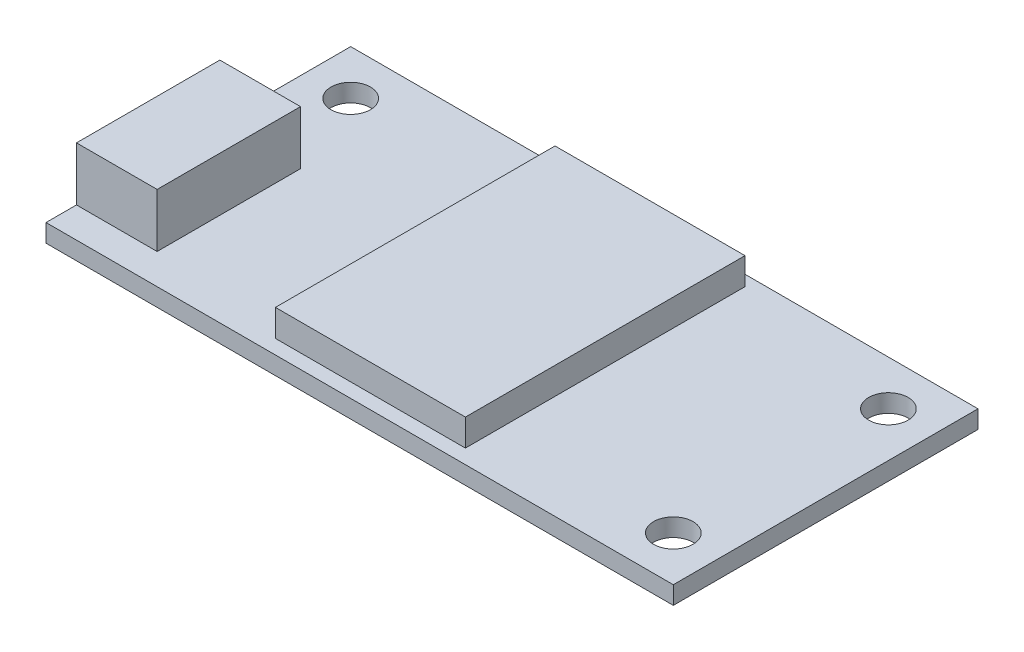
ISO-10303-21;
HEADER;
FILE_DESCRIPTION(('STEP AP214'),'2;1');
FILE_NAME('part.step','',(''),(''),'','','');
FILE_SCHEMA(('AUTOMOTIVE_DESIGN { 1 0 10303 214 1 1 1 1 }'));
ENDSEC;
DATA;
#1=APPLICATION_CONTEXT('core data for automotive mechanical design processes');
#2=APPLICATION_PROTOCOL_DEFINITION('international standard','automotive_design',2000,#1);
#3=PRODUCT_CONTEXT('',#1,'mechanical');
#4=PRODUCT('Part','Part','',(#3));
#5=PRODUCT_RELATED_PRODUCT_CATEGORY('part','',(#4));
#6=PRODUCT_DEFINITION_FORMATION('','',#4);
#7=PRODUCT_DEFINITION_CONTEXT('part definition',#1,'design');
#8=PRODUCT_DEFINITION('design','',#6,#7);
#9=PRODUCT_DEFINITION_SHAPE('','',#8);
#10=(LENGTH_UNIT() NAMED_UNIT(*) SI_UNIT(.MILLI.,.METRE.));
#11=(NAMED_UNIT(*) PLANE_ANGLE_UNIT() SI_UNIT($,.RADIAN.));
#12=(NAMED_UNIT(*) SI_UNIT($,.STERADIAN.) SOLID_ANGLE_UNIT());
#13=UNCERTAINTY_MEASURE_WITH_UNIT(LENGTH_MEASURE(1.E-05),#10,'distance_accuracy_value','');
#14=(GEOMETRIC_REPRESENTATION_CONTEXT(3) GLOBAL_UNCERTAINTY_ASSIGNED_CONTEXT((#13)) GLOBAL_UNIT_ASSIGNED_CONTEXT((#10,
#11,#12)) REPRESENTATION_CONTEXT('',''));
#15=CARTESIAN_POINT('',(0.,0.,0.));
#16=DIRECTION('',(0.,0.,1.));
#17=DIRECTION('',(1.,0.,0.));
#18=AXIS2_PLACEMENT_3D('',#15,#16,#17);
#19=CARTESIAN_POINT('',(0.,0.5,0.));
#20=DIRECTION('',(0.,-1.,0.));
#21=DIRECTION('',(0.,0.,-1.));
#22=AXIS2_PLACEMENT_3D('',#19,#20,#21);
#23=PLANE('',#22);
#24=CARTESIAN_POINT('',(-15.,0.5,-6.));
#25=DIRECTION('',(0.,-1.,0.));
#26=DIRECTION('',(0.,0.,-1.));
#27=AXIS2_PLACEMENT_3D('',#24,#25,#26);
#28=CIRCLE('',#27,1.1);
#29=CARTESIAN_POINT('',(-15.,0.5,-7.1));
#30=VERTEX_POINT('',#29);
#31=EDGE_CURVE('E420',#30,#30,#28,.T.);
#32=ORIENTED_EDGE('',*,*,#31,.T.);
#33=EDGE_LOOP('',(#32));
#34=FACE_BOUND('',#33,.T.);
#35=CARTESIAN_POINT('',(15.,0.5,6.));
#36=DIRECTION('',(0.,-1.,0.));
#37=DIRECTION('',(0.,0.,-1.));
#38=AXIS2_PLACEMENT_3D('',#35,#36,#37);
#39=CIRCLE('',#38,1.1);
#40=CARTESIAN_POINT('',(15.,0.5,4.9));
#41=VERTEX_POINT('',#40);
#42=EDGE_CURVE('E422',#41,#41,#39,.T.);
#43=ORIENTED_EDGE('',*,*,#42,.T.);
#44=EDGE_LOOP('',(#43));
#45=FACE_BOUND('',#44,.T.);
#46=CARTESIAN_POINT('',(15.,0.5,-6.));
#47=DIRECTION('',(0.,-1.,0.));
#48=DIRECTION('',(0.,0.,-1.));
#49=AXIS2_PLACEMENT_3D('',#46,#47,#48);
#50=CIRCLE('',#49,1.1);
#51=CARTESIAN_POINT('',(15.,0.5,-7.1));
#52=VERTEX_POINT('',#51);
#53=EDGE_CURVE('E428',#52,#52,#50,.T.);
#54=ORIENTED_EDGE('',*,*,#53,.T.);
#55=EDGE_LOOP('',(#54));
#56=FACE_BOUND('',#55,.T.);
#57=DIRECTION('',(-1.,0.,0.));
#58=VECTOR('',#57,1.);
#59=CARTESIAN_POINT('',(-17.5,0.5,-1.2));
#60=LINE('',#59,#58);
#61=CARTESIAN_POINT('',(-13.,0.5,-1.2));
#62=VERTEX_POINT('',#61);
#63=CARTESIAN_POINT('',(-17.5,0.5,-1.2));
#64=VERTEX_POINT('',#63);
#65=EDGE_CURVE('E168',#62,#64,#60,.T.);
#66=ORIENTED_EDGE('',*,*,#65,.F.);
#67=DIRECTION('',(0.,0.,-1.));
#68=VECTOR('',#67,1.);
#69=CARTESIAN_POINT('',(-13.,0.5,6.8));
#70=LINE('',#69,#68);
#71=CARTESIAN_POINT('',(-13.,0.5,6.8));
#72=VERTEX_POINT('',#71);
#73=EDGE_CURVE('E157',#72,#62,#70,.T.);
#74=ORIENTED_EDGE('',*,*,#73,.F.);
#75=DIRECTION('',(1.,0.,0.));
#76=VECTOR('',#75,1.);
#77=CARTESIAN_POINT('',(-17.5,0.5,6.8));
#78=LINE('',#77,#76);
#79=CARTESIAN_POINT('',(-17.5,0.5,6.8));
#80=VERTEX_POINT('',#79);
#81=EDGE_CURVE('E152',#80,#72,#78,.T.);
#82=ORIENTED_EDGE('',*,*,#81,.F.);
#83=DIRECTION('',(0.,0.,1.));
#84=VECTOR('',#83,1.);
#85=CARTESIAN_POINT('',(-17.5,0.5,8.5));
#86=LINE('',#85,#84);
#87=CARTESIAN_POINT('',(-17.5,0.5,8.5));
#88=VERTEX_POINT('',#87);
#89=EDGE_CURVE('E208',#80,#88,#86,.T.);
#90=ORIENTED_EDGE('',*,*,#89,.T.);
#91=DIRECTION('',(1.,0.,0.));
#92=VECTOR('',#91,1.);
#93=CARTESIAN_POINT('',(-17.5,0.5,8.5));
#94=LINE('',#93,#92);
#95=CARTESIAN_POINT('',(17.5,0.5,8.5));
#96=VERTEX_POINT('',#95);
#97=EDGE_CURVE('E212',#88,#96,#94,.T.);
#98=ORIENTED_EDGE('',*,*,#97,.T.);
#99=DIRECTION('',(0.,0.,-1.));
#100=VECTOR('',#99,1.);
#101=CARTESIAN_POINT('',(17.5,0.5,8.5));
#102=LINE('',#101,#100);
#103=CARTESIAN_POINT('',(17.5,0.5,-8.5));
#104=VERTEX_POINT('',#103);
#105=EDGE_CURVE('E200',#96,#104,#102,.T.);
#106=ORIENTED_EDGE('',*,*,#105,.T.);
#107=DIRECTION('',(-1.,0.,0.));
#108=VECTOR('',#107,1.);
#109=CARTESIAN_POINT('',(-17.5,0.5,-8.5));
#110=LINE('',#109,#108);
#111=CARTESIAN_POINT('',(-17.5,0.5,-8.5));
#112=VERTEX_POINT('',#111);
#113=EDGE_CURVE('E204',#104,#112,#110,.T.);
#114=ORIENTED_EDGE('',*,*,#113,.T.);
#115=EDGE_CURVE('E209',#112,#64,#86,.T.);
#116=ORIENTED_EDGE('',*,*,#115,.T.);
#117=EDGE_LOOP('',(#66,#74,#82,#90,#98,#106,#114,#116));
#118=FACE_BOUND('',#117,.T.);
#119=DIRECTION('',(0.,0.,1.));
#120=VECTOR('',#119,1.);
#121=CARTESIAN_POINT('',(-5.5,0.5,7.7));
#122=LINE('',#121,#120);
#123=CARTESIAN_POINT('',(-5.5,0.5,-7.9));
#124=VERTEX_POINT('',#123);
#125=CARTESIAN_POINT('',(-5.5,0.5,7.7));
#126=VERTEX_POINT('',#125);
#127=EDGE_CURVE('E150',#124,#126,#122,.T.);
#128=ORIENTED_EDGE('',*,*,#127,.F.);
#129=DIRECTION('',(-1.,0.,0.));
#130=VECTOR('',#129,1.);
#131=CARTESIAN_POINT('',(-5.5,0.5,-7.9));
#132=LINE('',#131,#130);
#133=CARTESIAN_POINT('',(5.1,0.5,-7.9));
#134=VERTEX_POINT('',#133);
#135=EDGE_CURVE('E147',#134,#124,#132,.T.);
#136=ORIENTED_EDGE('',*,*,#135,.F.);
#137=DIRECTION('',(0.,0.,-1.));
#138=VECTOR('',#137,1.);
#139=CARTESIAN_POINT('',(5.1,0.5,7.7));
#140=LINE('',#139,#138);
#141=CARTESIAN_POINT('',(5.1,0.5,7.7));
#142=VERTEX_POINT('',#141);
#143=EDGE_CURVE('E59',#142,#134,#140,.T.);
#144=ORIENTED_EDGE('',*,*,#143,.F.);
#145=DIRECTION('',(1.,0.,0.));
#146=VECTOR('',#145,1.);
#147=CARTESIAN_POINT('',(-5.5,0.5,7.7));
#148=LINE('',#147,#146);
#149=EDGE_CURVE('E54',#126,#142,#148,.T.);
#150=ORIENTED_EDGE('',*,*,#149,.F.);
#151=EDGE_LOOP('',(#128,#136,#144,#150));
#152=FACE_BOUND('',#151,.T.);
#153=ADVANCED_FACE('F38',(#34,#45,#56,#118,#152),#23,.F.);
#154=CARTESIAN_POINT('',(17.5,0.5,8.5));
#155=DIRECTION('',(-1.,0.,0.));
#156=DIRECTION('',(0.,0.,1.));
#157=AXIS2_PLACEMENT_3D('',#154,#155,#156);
#158=PLANE('',#157);
#159=DIRECTION('',(0.,0.,-1.));
#160=VECTOR('',#159,1.);
#161=CARTESIAN_POINT('',(17.5,-0.5,8.5));
#162=LINE('',#161,#160);
#163=CARTESIAN_POINT('',(17.5,-0.5,8.5));
#164=VERTEX_POINT('',#163);
#165=CARTESIAN_POINT('',(17.5,-0.5,-8.5));
#166=VERTEX_POINT('',#165);
#167=EDGE_CURVE('E199',#164,#166,#162,.T.);
#168=ORIENTED_EDGE('',*,*,#167,.T.);
#169=DIRECTION('',(0.,-1.,0.));
#170=VECTOR('',#169,1.);
#171=CARTESIAN_POINT('',(17.5,0.5,-8.5));
#172=LINE('',#171,#170);
#173=EDGE_CURVE('E11',#104,#166,#172,.T.);
#174=ORIENTED_EDGE('',*,*,#173,.F.);
#175=ORIENTED_EDGE('',*,*,#105,.F.);
#176=DIRECTION('',(0.,-1.,0.));
#177=VECTOR('',#176,1.);
#178=CARTESIAN_POINT('',(17.5,0.5,8.5));
#179=LINE('',#178,#177);
#180=EDGE_CURVE('E215',#96,#164,#179,.T.);
#181=ORIENTED_EDGE('',*,*,#180,.T.);
#182=EDGE_LOOP('',(#168,#174,#175,#181));
#183=FACE_BOUND('',#182,.T.);
#184=ADVANCED_FACE('F40',(#183),#158,.F.);
#185=CARTESIAN_POINT('',(-17.5,0.5,-8.5));
#186=DIRECTION('',(0.,0.,1.));
#187=DIRECTION('',(1.,0.,0.));
#188=AXIS2_PLACEMENT_3D('',#185,#186,#187);
#189=PLANE('',#188);
#190=DIRECTION('',(-1.,0.,0.));
#191=VECTOR('',#190,1.);
#192=CARTESIAN_POINT('',(-17.5,-0.5,-8.5));
#193=LINE('',#192,#191);
#194=CARTESIAN_POINT('',(-17.5,-0.5,-8.5));
#195=VERTEX_POINT('',#194);
#196=EDGE_CURVE('E219',#166,#195,#193,.T.);
#197=ORIENTED_EDGE('',*,*,#196,.T.);
#198=DIRECTION('',(0.,-1.,0.));
#199=VECTOR('',#198,1.);
#200=CARTESIAN_POINT('',(-17.5,0.5,-8.5));
#201=LINE('',#200,#199);
#202=EDGE_CURVE('E47',#112,#195,#201,.T.);
#203=ORIENTED_EDGE('',*,*,#202,.F.);
#204=ORIENTED_EDGE('',*,*,#113,.F.);
#205=ORIENTED_EDGE('',*,*,#173,.T.);
#206=EDGE_LOOP('',(#197,#203,#204,#205));
#207=FACE_BOUND('',#206,.T.);
#208=ADVANCED_FACE('F287',(#207),#189,.F.);
#209=CARTESIAN_POINT('',(-17.5,0.5,8.5));
#210=DIRECTION('',(1.,0.,0.));
#211=DIRECTION('',(0.,0.,-1.));
#212=AXIS2_PLACEMENT_3D('',#209,#210,#211);
#213=PLANE('',#212);
#214=DIRECTION('',(0.,0.,1.));
#215=VECTOR('',#214,1.);
#216=CARTESIAN_POINT('',(-17.5,-0.5,8.5));
#217=LINE('',#216,#215);
#218=CARTESIAN_POINT('',(-17.5,-0.5,8.5));
#219=VERTEX_POINT('',#218);
#220=EDGE_CURVE('E222',#195,#219,#217,.T.);
#221=ORIENTED_EDGE('',*,*,#220,.T.);
#222=DIRECTION('',(0.,-1.,0.));
#223=VECTOR('',#222,1.);
#224=CARTESIAN_POINT('',(-17.5,0.5,8.5));
#225=LINE('',#224,#223);
#226=EDGE_CURVE('E230',#88,#219,#225,.T.);
#227=ORIENTED_EDGE('',*,*,#226,.F.);
#228=ORIENTED_EDGE('',*,*,#89,.F.);
#229=DIRECTION('',(0.,-1.,0.));
#230=VECTOR('',#229,1.);
#231=CARTESIAN_POINT('',(-17.5,3.5,6.8));
#232=LINE('',#231,#230);
#233=CARTESIAN_POINT('',(-17.5,3.5,6.8));
#234=VERTEX_POINT('',#233);
#235=EDGE_CURVE('E195',#234,#80,#232,.T.);
#236=ORIENTED_EDGE('',*,*,#235,.F.);
#237=DIRECTION('',(0.,0.,1.));
#238=VECTOR('',#237,1.);
#239=CARTESIAN_POINT('',(-17.5,3.5,6.8));
#240=LINE('',#239,#238);
#241=CARTESIAN_POINT('',(-17.5,3.5,-1.2));
#242=VERTEX_POINT('',#241);
#243=EDGE_CURVE('E163',#242,#234,#240,.T.);
#244=ORIENTED_EDGE('',*,*,#243,.F.);
#245=DIRECTION('',(0.,-1.,0.));
#246=VECTOR('',#245,1.);
#247=CARTESIAN_POINT('',(-17.5,3.5,-1.2));
#248=LINE('',#247,#246);
#249=EDGE_CURVE('E176',#242,#64,#248,.T.);
#250=ORIENTED_EDGE('',*,*,#249,.T.);
#251=ORIENTED_EDGE('',*,*,#115,.F.);
#252=ORIENTED_EDGE('',*,*,#202,.T.);
#253=EDGE_LOOP('',(#221,#227,#228,#236,#244,#250,#251,#252));
#254=FACE_BOUND('',#253,.T.);
#255=ADVANCED_FACE('F239',(#254),#213,.F.);
#256=CARTESIAN_POINT('',(-17.5,0.5,8.5));
#257=DIRECTION('',(0.,0.,-1.));
#258=DIRECTION('',(-1.,0.,0.));
#259=AXIS2_PLACEMENT_3D('',#256,#257,#258);
#260=PLANE('',#259);
#261=DIRECTION('',(1.,0.,0.));
#262=VECTOR('',#261,1.);
#263=CARTESIAN_POINT('',(-17.5,-0.5,8.5));
#264=LINE('',#263,#262);
#265=EDGE_CURVE('E205',#219,#164,#264,.T.);
#266=ORIENTED_EDGE('',*,*,#265,.T.);
#267=ORIENTED_EDGE('',*,*,#180,.F.);
#268=ORIENTED_EDGE('',*,*,#97,.F.);
#269=ORIENTED_EDGE('',*,*,#226,.T.);
#270=EDGE_LOOP('',(#266,#267,#268,#269));
#271=FACE_BOUND('',#270,.T.);
#272=ADVANCED_FACE('F248',(#271),#260,.F.);
#273=CARTESIAN_POINT('',(0.,-0.5,0.));
#274=DIRECTION('',(0.,-1.,0.));
#275=DIRECTION('',(0.,0.,-1.));
#276=AXIS2_PLACEMENT_3D('',#273,#274,#275);
#277=PLANE('',#276);
#278=CARTESIAN_POINT('',(-15.,-0.5,-6.));
#279=DIRECTION('',(0.,1.,0.));
#280=DIRECTION('',(0.,0.,1.));
#281=AXIS2_PLACEMENT_3D('',#278,#279,#280);
#282=CIRCLE('',#281,1.1);
#283=CARTESIAN_POINT('',(-15.,-0.5,-4.9));
#284=VERTEX_POINT('',#283);
#285=EDGE_CURVE('E418',#284,#284,#282,.T.);
#286=ORIENTED_EDGE('',*,*,#285,.T.);
#287=EDGE_LOOP('',(#286));
#288=FACE_BOUND('',#287,.T.);
#289=CARTESIAN_POINT('',(15.,-0.5,6.));
#290=DIRECTION('',(0.,1.,0.));
#291=DIRECTION('',(0.,0.,1.));
#292=AXIS2_PLACEMENT_3D('',#289,#290,#291);
#293=CIRCLE('',#292,1.1);
#294=CARTESIAN_POINT('',(15.,-0.5,7.1));
#295=VERTEX_POINT('',#294);
#296=EDGE_CURVE('E455',#295,#295,#293,.T.);
#297=ORIENTED_EDGE('',*,*,#296,.T.);
#298=EDGE_LOOP('',(#297));
#299=FACE_BOUND('',#298,.T.);
#300=CARTESIAN_POINT('',(15.,-0.5,-6.));
#301=DIRECTION('',(0.,1.,0.));
#302=DIRECTION('',(0.,0.,1.));
#303=AXIS2_PLACEMENT_3D('',#300,#301,#302);
#304=CIRCLE('',#303,1.1);
#305=CARTESIAN_POINT('',(15.,-0.5,-4.9));
#306=VERTEX_POINT('',#305);
#307=EDGE_CURVE('E451',#306,#306,#304,.T.);
#308=ORIENTED_EDGE('',*,*,#307,.T.);
#309=EDGE_LOOP('',(#308));
#310=FACE_BOUND('',#309,.T.);
#311=ORIENTED_EDGE('',*,*,#167,.F.);
#312=ORIENTED_EDGE('',*,*,#265,.F.);
#313=ORIENTED_EDGE('',*,*,#220,.F.);
#314=ORIENTED_EDGE('',*,*,#196,.F.);
#315=EDGE_LOOP('',(#311,#312,#313,#314));
#316=FACE_BOUND('',#315,.T.);
#317=ADVANCED_FACE('F245',(#288,#299,#310,#316),#277,.T.);
#318=CARTESIAN_POINT('',(-17.5,3.5,6.8));
#319=DIRECTION('',(0.,0.,-1.));
#320=DIRECTION('',(-1.,0.,0.));
#321=AXIS2_PLACEMENT_3D('',#318,#319,#320);
#322=PLANE('',#321);
#323=ORIENTED_EDGE('',*,*,#81,.T.);
#324=DIRECTION('',(0.,-1.,0.));
#325=VECTOR('',#324,1.);
#326=CARTESIAN_POINT('',(-13.,3.5,6.8));
#327=LINE('',#326,#325);
#328=CARTESIAN_POINT('',(-13.,3.5,6.8));
#329=VERTEX_POINT('',#328);
#330=EDGE_CURVE('E191',#329,#72,#327,.T.);
#331=ORIENTED_EDGE('',*,*,#330,.F.);
#332=DIRECTION('',(1.,0.,0.));
#333=VECTOR('',#332,1.);
#334=CARTESIAN_POINT('',(-17.5,3.5,6.8));
#335=LINE('',#334,#333);
#336=EDGE_CURVE('E167',#234,#329,#335,.T.);
#337=ORIENTED_EDGE('',*,*,#336,.F.);
#338=ORIENTED_EDGE('',*,*,#235,.T.);
#339=EDGE_LOOP('',(#323,#331,#337,#338));
#340=FACE_BOUND('',#339,.T.);
#341=ADVANCED_FACE('F259',(#340),#322,.F.);
#342=CARTESIAN_POINT('',(-13.,3.5,6.8));
#343=DIRECTION('',(-1.,0.,0.));
#344=DIRECTION('',(0.,0.,1.));
#345=AXIS2_PLACEMENT_3D('',#342,#343,#344);
#346=PLANE('',#345);
#347=ORIENTED_EDGE('',*,*,#73,.T.);
#348=DIRECTION('',(0.,-1.,0.));
#349=VECTOR('',#348,1.);
#350=CARTESIAN_POINT('',(-13.,3.5,-1.2));
#351=LINE('',#350,#349);
#352=CARTESIAN_POINT('',(-13.,3.5,-1.2));
#353=VERTEX_POINT('',#352);
#354=EDGE_CURVE('E187',#353,#62,#351,.T.);
#355=ORIENTED_EDGE('',*,*,#354,.F.);
#356=DIRECTION('',(0.,0.,-1.));
#357=VECTOR('',#356,1.);
#358=CARTESIAN_POINT('',(-13.,3.5,6.8));
#359=LINE('',#358,#357);
#360=EDGE_CURVE('E171',#329,#353,#359,.T.);
#361=ORIENTED_EDGE('',*,*,#360,.F.);
#362=ORIENTED_EDGE('',*,*,#330,.T.);
#363=EDGE_LOOP('',(#347,#355,#361,#362));
#364=FACE_BOUND('',#363,.T.);
#365=ADVANCED_FACE('F270',(#364),#346,.F.);
#366=CARTESIAN_POINT('',(-17.5,3.5,-1.2));
#367=DIRECTION('',(0.,0.,1.));
#368=DIRECTION('',(1.,0.,0.));
#369=AXIS2_PLACEMENT_3D('',#366,#367,#368);
#370=PLANE('',#369);
#371=ORIENTED_EDGE('',*,*,#65,.T.);
#372=ORIENTED_EDGE('',*,*,#249,.F.);
#373=DIRECTION('',(-1.,0.,0.));
#374=VECTOR('',#373,1.);
#375=CARTESIAN_POINT('',(-17.5,3.5,-1.2));
#376=LINE('',#375,#374);
#377=EDGE_CURVE('E174',#353,#242,#376,.T.);
#378=ORIENTED_EDGE('',*,*,#377,.F.);
#379=ORIENTED_EDGE('',*,*,#354,.T.);
#380=EDGE_LOOP('',(#371,#372,#378,#379));
#381=FACE_BOUND('',#380,.T.);
#382=ADVANCED_FACE('F267',(#381),#370,.F.);
#383=CARTESIAN_POINT('',(0.,3.5,0.));
#384=DIRECTION('',(0.,-1.,0.));
#385=DIRECTION('',(0.,0.,-1.));
#386=AXIS2_PLACEMENT_3D('',#383,#384,#385);
#387=PLANE('',#386);
#388=ORIENTED_EDGE('',*,*,#243,.T.);
#389=ORIENTED_EDGE('',*,*,#336,.T.);
#390=ORIENTED_EDGE('',*,*,#360,.T.);
#391=ORIENTED_EDGE('',*,*,#377,.T.);
#392=EDGE_LOOP('',(#388,#389,#390,#391));
#393=FACE_BOUND('',#392,.T.);
#394=ADVANCED_FACE('F263',(#393),#387,.F.);
#395=CARTESIAN_POINT('',(-5.5,2.,7.7));
#396=DIRECTION('',(1.,0.,0.));
#397=DIRECTION('',(0.,0.,-1.));
#398=AXIS2_PLACEMENT_3D('',#395,#396,#397);
#399=PLANE('',#398);
#400=ORIENTED_EDGE('',*,*,#127,.T.);
#401=DIRECTION('',(0.,-1.,0.));
#402=VECTOR('',#401,1.);
#403=CARTESIAN_POINT('',(-5.5,2.,7.7));
#404=LINE('',#403,#402);
#405=CARTESIAN_POINT('',(-5.5,2.,7.7));
#406=VERTEX_POINT('',#405);
#407=EDGE_CURVE('E129',#406,#126,#404,.T.);
#408=ORIENTED_EDGE('',*,*,#407,.F.);
#409=DIRECTION('',(0.,0.,1.));
#410=VECTOR('',#409,1.);
#411=CARTESIAN_POINT('',(-5.5,2.,7.7));
#412=LINE('',#411,#410);
#413=CARTESIAN_POINT('',(-5.5,2.,-7.9));
#414=VERTEX_POINT('',#413);
#415=EDGE_CURVE('E137',#414,#406,#412,.T.);
#416=ORIENTED_EDGE('',*,*,#415,.F.);
#417=DIRECTION('',(0.,-1.,0.));
#418=VECTOR('',#417,1.);
#419=CARTESIAN_POINT('',(-5.5,2.,-7.9));
#420=LINE('',#419,#418);
#421=EDGE_CURVE('E435',#414,#124,#420,.T.);
#422=ORIENTED_EDGE('',*,*,#421,.T.);
#423=EDGE_LOOP('',(#400,#408,#416,#422));
#424=FACE_BOUND('',#423,.T.);
#425=ADVANCED_FACE('F149',(#424),#399,.F.);
#426=CARTESIAN_POINT('',(-5.5,2.,7.7));
#427=DIRECTION('',(0.,0.,-1.));
#428=DIRECTION('',(-1.,0.,0.));
#429=AXIS2_PLACEMENT_3D('',#426,#427,#428);
#430=PLANE('',#429);
#431=ORIENTED_EDGE('',*,*,#149,.T.);
#432=DIRECTION('',(0.,-1.,0.));
#433=VECTOR('',#432,1.);
#434=CARTESIAN_POINT('',(5.1,2.,7.7));
#435=LINE('',#434,#433);
#436=CARTESIAN_POINT('',(5.1,2.,7.7));
#437=VERTEX_POINT('',#436);
#438=EDGE_CURVE('E132',#437,#142,#435,.T.);
#439=ORIENTED_EDGE('',*,*,#438,.F.);
#440=DIRECTION('',(1.,0.,0.));
#441=VECTOR('',#440,1.);
#442=CARTESIAN_POINT('',(-5.5,2.,7.7));
#443=LINE('',#442,#441);
#444=EDGE_CURVE('E125',#406,#437,#443,.T.);
#445=ORIENTED_EDGE('',*,*,#444,.F.);
#446=ORIENTED_EDGE('',*,*,#407,.T.);
#447=EDGE_LOOP('',(#431,#439,#445,#446));
#448=FACE_BOUND('',#447,.T.);
#449=ADVANCED_FACE('F127',(#448),#430,.F.);
#450=CARTESIAN_POINT('',(5.1,2.,7.7));
#451=DIRECTION('',(-1.,0.,0.));
#452=DIRECTION('',(0.,0.,1.));
#453=AXIS2_PLACEMENT_3D('',#450,#451,#452);
#454=PLANE('',#453);
#455=ORIENTED_EDGE('',*,*,#143,.T.);
#456=DIRECTION('',(0.,-1.,0.));
#457=VECTOR('',#456,1.);
#458=CARTESIAN_POINT('',(5.1,2.,-7.9));
#459=LINE('',#458,#457);
#460=CARTESIAN_POINT('',(5.1,2.,-7.9));
#461=VERTEX_POINT('',#460);
#462=EDGE_CURVE('E159',#461,#134,#459,.T.);
#463=ORIENTED_EDGE('',*,*,#462,.F.);
#464=DIRECTION('',(0.,0.,-1.));
#465=VECTOR('',#464,1.);
#466=CARTESIAN_POINT('',(5.1,2.,7.7));
#467=LINE('',#466,#465);
#468=EDGE_CURVE('E136',#437,#461,#467,.T.);
#469=ORIENTED_EDGE('',*,*,#468,.F.);
#470=ORIENTED_EDGE('',*,*,#438,.T.);
#471=EDGE_LOOP('',(#455,#463,#469,#470));
#472=FACE_BOUND('',#471,.T.);
#473=ADVANCED_FACE('F356',(#472),#454,.F.);
#474=CARTESIAN_POINT('',(-5.5,2.,-7.9));
#475=DIRECTION('',(0.,0.,1.));
#476=DIRECTION('',(1.,0.,0.));
#477=AXIS2_PLACEMENT_3D('',#474,#475,#476);
#478=PLANE('',#477);
#479=ORIENTED_EDGE('',*,*,#135,.T.);
#480=ORIENTED_EDGE('',*,*,#421,.F.);
#481=DIRECTION('',(-1.,0.,0.));
#482=VECTOR('',#481,1.);
#483=CARTESIAN_POINT('',(-5.5,2.,-7.9));
#484=LINE('',#483,#482);
#485=EDGE_CURVE('E142',#461,#414,#484,.T.);
#486=ORIENTED_EDGE('',*,*,#485,.F.);
#487=ORIENTED_EDGE('',*,*,#462,.T.);
#488=EDGE_LOOP('',(#479,#480,#486,#487));
#489=FACE_BOUND('',#488,.T.);
#490=ADVANCED_FACE('F365',(#489),#478,.F.);
#491=CARTESIAN_POINT('',(0.,2.,0.));
#492=DIRECTION('',(0.,-1.,0.));
#493=DIRECTION('',(0.,0.,-1.));
#494=AXIS2_PLACEMENT_3D('',#491,#492,#493);
#495=PLANE('',#494);
#496=ORIENTED_EDGE('',*,*,#415,.T.);
#497=ORIENTED_EDGE('',*,*,#444,.T.);
#498=ORIENTED_EDGE('',*,*,#468,.T.);
#499=ORIENTED_EDGE('',*,*,#485,.T.);
#500=EDGE_LOOP('',(#496,#497,#498,#499));
#501=FACE_BOUND('',#500,.T.);
#502=ADVANCED_FACE('F140',(#501),#495,.F.);
#503=CARTESIAN_POINT('',(15.,-0.5,-6.));
#504=DIRECTION('',(0.,1.,0.));
#505=DIRECTION('',(0.,0.,1.));
#506=AXIS2_PLACEMENT_3D('',#503,#504,#505);
#507=CYLINDRICAL_SURFACE('',#506,1.1);
#508=ORIENTED_EDGE('',*,*,#307,.F.);
#509=EDGE_LOOP('',(#508));
#510=FACE_BOUND('',#509,.T.);
#511=ORIENTED_EDGE('',*,*,#53,.F.);
#512=EDGE_LOOP('',(#511));
#513=FACE_BOUND('',#512,.T.);
#514=ADVANCED_FACE('F382',(#510,#513),#507,.F.);
#515=CARTESIAN_POINT('',(15.,-0.5,6.));
#516=DIRECTION('',(0.,1.,0.));
#517=DIRECTION('',(0.,0.,1.));
#518=AXIS2_PLACEMENT_3D('',#515,#516,#517);
#519=CYLINDRICAL_SURFACE('',#518,1.1);
#520=ORIENTED_EDGE('',*,*,#296,.F.);
#521=EDGE_LOOP('',(#520));
#522=FACE_BOUND('',#521,.T.);
#523=ORIENTED_EDGE('',*,*,#42,.F.);
#524=EDGE_LOOP('',(#523));
#525=FACE_BOUND('',#524,.T.);
#526=ADVANCED_FACE('F391',(#522,#525),#519,.F.);
#527=CARTESIAN_POINT('',(-15.,-0.5,-6.));
#528=DIRECTION('',(0.,1.,0.));
#529=DIRECTION('',(0.,0.,1.));
#530=AXIS2_PLACEMENT_3D('',#527,#528,#529);
#531=CYLINDRICAL_SURFACE('',#530,1.1);
#532=ORIENTED_EDGE('',*,*,#285,.F.);
#533=EDGE_LOOP('',(#532));
#534=FACE_BOUND('',#533,.T.);
#535=ORIENTED_EDGE('',*,*,#31,.F.);
#536=EDGE_LOOP('',(#535));
#537=FACE_BOUND('',#536,.T.);
#538=ADVANCED_FACE('F398',(#534,#537),#531,.F.);
#539=CLOSED_SHELL('',(#153,#184,#208,#255,#272,#317,#341,#365,#382,#394,#425,#449,#473,#490,
#502,#514,#526,#538));
#540=MANIFOLD_SOLID_BREP('B2',#539);
#541=ADVANCED_BREP_SHAPE_REPRESENTATION('',(#18,#540),#14);
#542=SHAPE_DEFINITION_REPRESENTATION(#9,#541);
ENDSEC;
END-ISO-10303-21;
